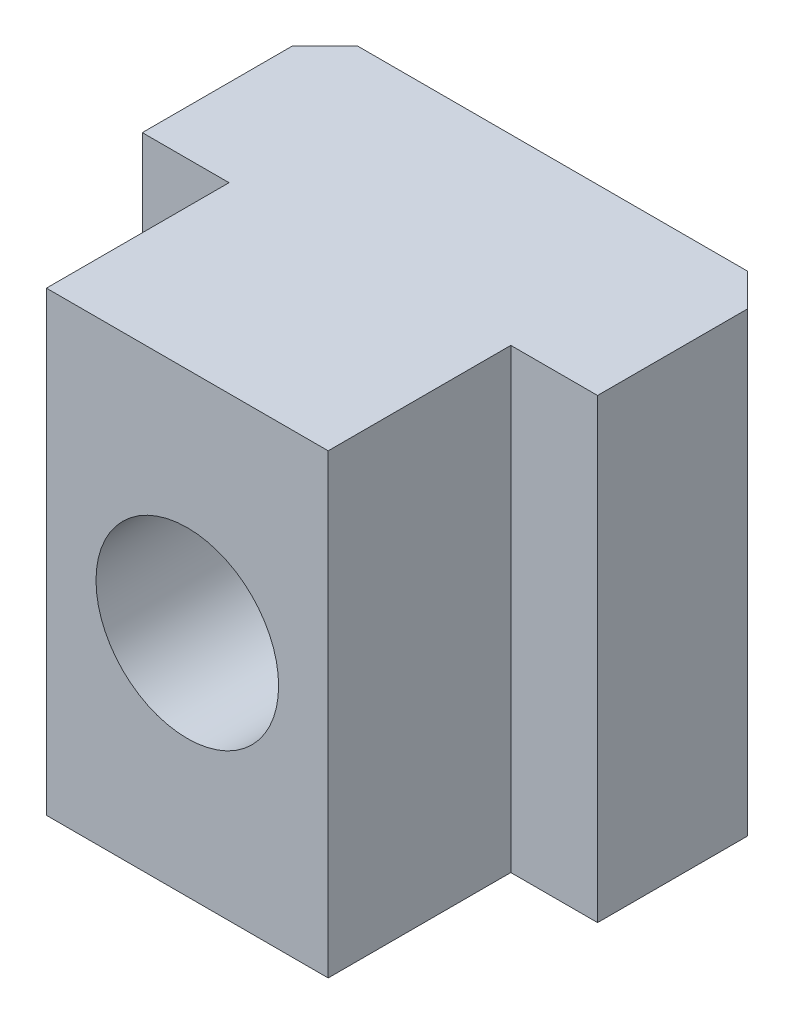
ISO-10303-21;
HEADER;
FILE_DESCRIPTION(('STEP AP214'),'2;1');
FILE_NAME('part.step','',(''),(''),'','','');
FILE_SCHEMA(('AUTOMOTIVE_DESIGN { 1 0 10303 214 1 1 1 1 }'));
ENDSEC;
DATA;
#1=APPLICATION_CONTEXT('core data for automotive mechanical design processes');
#2=APPLICATION_PROTOCOL_DEFINITION('international standard','automotive_design',2000,#1);
#3=PRODUCT_CONTEXT('',#1,'mechanical');
#4=PRODUCT('Part','Part','',(#3));
#5=PRODUCT_RELATED_PRODUCT_CATEGORY('part','',(#4));
#6=PRODUCT_DEFINITION_FORMATION('','',#4);
#7=PRODUCT_DEFINITION_CONTEXT('part definition',#1,'design');
#8=PRODUCT_DEFINITION('design','',#6,#7);
#9=PRODUCT_DEFINITION_SHAPE('','',#8);
#10=(LENGTH_UNIT() NAMED_UNIT(*) SI_UNIT(.MILLI.,.METRE.));
#11=(NAMED_UNIT(*) PLANE_ANGLE_UNIT() SI_UNIT($,.RADIAN.));
#12=(NAMED_UNIT(*) SI_UNIT($,.STERADIAN.) SOLID_ANGLE_UNIT());
#13=UNCERTAINTY_MEASURE_WITH_UNIT(LENGTH_MEASURE(1.E-05),#10,'distance_accuracy_value','');
#14=(GEOMETRIC_REPRESENTATION_CONTEXT(3) GLOBAL_UNCERTAINTY_ASSIGNED_CONTEXT((#13)) GLOBAL_UNIT_ASSIGNED_CONTEXT((#10,
#11,#12)) REPRESENTATION_CONTEXT('',''));
#15=CARTESIAN_POINT('',(0.,0.,0.));
#16=DIRECTION('',(0.,0.,1.));
#17=DIRECTION('',(1.,0.,0.));
#18=AXIS2_PLACEMENT_3D('',#15,#16,#17);
#19=CARTESIAN_POINT('',(-10.8,17.5,14.));
#20=DIRECTION('',(1.,0.,0.));
#21=DIRECTION('',(0.,0.,-1.));
#22=AXIS2_PLACEMENT_3D('',#19,#20,#21);
#23=PLANE('',#22);
#24=DIRECTION('',(0.,0.,1.));
#25=VECTOR('',#24,1.);
#26=CARTESIAN_POINT('',(-10.8,-17.5,14.));
#27=LINE('',#26,#25);
#28=CARTESIAN_POINT('',(-10.8,-17.5,0.));
#29=VERTEX_POINT('',#28);
#30=CARTESIAN_POINT('',(-10.8,-17.5,14.));
#31=VERTEX_POINT('',#30);
#32=EDGE_CURVE('E145',#29,#31,#27,.T.);
#33=ORIENTED_EDGE('',*,*,#32,.T.);
#34=DIRECTION('',(0.,-1.,0.));
#35=VECTOR('',#34,1.);
#36=CARTESIAN_POINT('',(-10.8,17.5,14.));
#37=LINE('',#36,#35);
#38=CARTESIAN_POINT('',(-10.8,17.5,14.));
#39=VERTEX_POINT('',#38);
#40=EDGE_CURVE('E11',#39,#31,#37,.T.);
#41=ORIENTED_EDGE('',*,*,#40,.F.);
#42=DIRECTION('',(0.,0.,1.));
#43=VECTOR('',#42,1.);
#44=CARTESIAN_POINT('',(-10.8,17.5,14.));
#45=LINE('',#44,#43);
#46=CARTESIAN_POINT('',(-10.8,17.5,0.));
#47=VERTEX_POINT('',#46);
#48=EDGE_CURVE('E164',#47,#39,#45,.T.);
#49=ORIENTED_EDGE('',*,*,#48,.F.);
#50=DIRECTION('',(0.,-1.,0.));
#51=VECTOR('',#50,1.);
#52=CARTESIAN_POINT('',(-10.8,17.5,0.));
#53=LINE('',#52,#51);
#54=EDGE_CURVE('E141',#47,#29,#53,.T.);
#55=ORIENTED_EDGE('',*,*,#54,.T.);
#56=EDGE_LOOP('',(#33,#41,#49,#55));
#57=FACE_BOUND('',#56,.T.);
#58=ADVANCED_FACE('F37',(#57),#23,.F.);
#59=CARTESIAN_POINT('',(10.8,17.5,14.));
#60=DIRECTION('',(0.,0.,-1.));
#61=DIRECTION('',(-1.,0.,0.));
#62=AXIS2_PLACEMENT_3D('',#59,#60,#61);
#63=PLANE('',#62);
#64=CARTESIAN_POINT('',(0.,0.,14.));
#65=DIRECTION('',(0.,0.,1.));
#66=DIRECTION('',(1.,0.,0.));
#67=AXIS2_PLACEMENT_3D('',#64,#65,#66);
#68=CIRCLE('',#67,7.);
#69=CARTESIAN_POINT('',(7.,0.,14.));
#70=VERTEX_POINT('',#69);
#71=EDGE_CURVE('E213',#70,#70,#68,.T.);
#72=ORIENTED_EDGE('',*,*,#71,.F.);
#73=EDGE_LOOP('',(#72));
#74=FACE_BOUND('',#73,.T.);
#75=DIRECTION('',(1.,0.,0.));
#76=VECTOR('',#75,1.);
#77=CARTESIAN_POINT('',(10.8,-17.5,14.));
#78=LINE('',#77,#76);
#79=CARTESIAN_POINT('',(10.8,-17.5,14.));
#80=VERTEX_POINT('',#79);
#81=EDGE_CURVE('E148',#31,#80,#78,.T.);
#82=ORIENTED_EDGE('',*,*,#81,.T.);
#83=DIRECTION('',(0.,-1.,0.));
#84=VECTOR('',#83,1.);
#85=CARTESIAN_POINT('',(10.8,17.5,14.));
#86=LINE('',#85,#84);
#87=CARTESIAN_POINT('',(10.8,17.5,14.));
#88=VERTEX_POINT('',#87);
#89=EDGE_CURVE('E45',#88,#80,#86,.T.);
#90=ORIENTED_EDGE('',*,*,#89,.F.);
#91=DIRECTION('',(1.,0.,0.));
#92=VECTOR('',#91,1.);
#93=CARTESIAN_POINT('',(10.8,17.5,14.));
#94=LINE('',#93,#92);
#95=EDGE_CURVE('E102',#39,#88,#94,.T.);
#96=ORIENTED_EDGE('',*,*,#95,.F.);
#97=ORIENTED_EDGE('',*,*,#40,.T.);
#98=EDGE_LOOP('',(#82,#90,#96,#97));
#99=FACE_BOUND('',#98,.T.);
#100=ADVANCED_FACE('F219',(#74,#99),#63,.F.);
#101=CARTESIAN_POINT('',(10.8,17.5,0.));
#102=DIRECTION('',(-1.,0.,0.));
#103=DIRECTION('',(0.,0.,1.));
#104=AXIS2_PLACEMENT_3D('',#101,#102,#103);
#105=PLANE('',#104);
#106=DIRECTION('',(0.,0.,-1.));
#107=VECTOR('',#106,1.);
#108=CARTESIAN_POINT('',(10.8,-17.5,0.));
#109=LINE('',#108,#107);
#110=CARTESIAN_POINT('',(10.8,-17.5,0.));
#111=VERTEX_POINT('',#110);
#112=EDGE_CURVE('E151',#80,#111,#109,.T.);
#113=ORIENTED_EDGE('',*,*,#112,.T.);
#114=DIRECTION('',(0.,-1.,0.));
#115=VECTOR('',#114,1.);
#116=CARTESIAN_POINT('',(10.8,17.5,0.));
#117=LINE('',#116,#115);
#118=CARTESIAN_POINT('',(10.8,17.5,0.));
#119=VERTEX_POINT('',#118);
#120=EDGE_CURVE('E177',#119,#111,#117,.T.);
#121=ORIENTED_EDGE('',*,*,#120,.F.);
#122=DIRECTION('',(0.,0.,-1.));
#123=VECTOR('',#122,1.);
#124=CARTESIAN_POINT('',(10.8,17.5,0.));
#125=LINE('',#124,#123);
#126=EDGE_CURVE('E185',#88,#119,#125,.T.);
#127=ORIENTED_EDGE('',*,*,#126,.F.);
#128=ORIENTED_EDGE('',*,*,#89,.T.);
#129=EDGE_LOOP('',(#113,#121,#127,#128));
#130=FACE_BOUND('',#129,.T.);
#131=ADVANCED_FACE('F183',(#130),#105,.F.);
#132=CARTESIAN_POINT('',(17.45,17.5,0.));
#133=DIRECTION('',(0.,0.,-1.));
#134=DIRECTION('',(-1.,0.,0.));
#135=AXIS2_PLACEMENT_3D('',#132,#133,#134);
#136=PLANE('',#135);
#137=DIRECTION('',(1.,0.,0.));
#138=VECTOR('',#137,1.);
#139=CARTESIAN_POINT('',(17.45,-17.5,0.));
#140=LINE('',#139,#138);
#141=CARTESIAN_POINT('',(17.45,-17.5,0.));
#142=VERTEX_POINT('',#141);
#143=EDGE_CURVE('E153',#111,#142,#140,.T.);
#144=ORIENTED_EDGE('',*,*,#143,.T.);
#145=DIRECTION('',(0.,-1.,0.));
#146=VECTOR('',#145,1.);
#147=CARTESIAN_POINT('',(17.45,17.5,0.));
#148=LINE('',#147,#146);
#149=CARTESIAN_POINT('',(17.45,17.5,0.));
#150=VERTEX_POINT('',#149);
#151=EDGE_CURVE('E174',#150,#142,#148,.T.);
#152=ORIENTED_EDGE('',*,*,#151,.F.);
#153=DIRECTION('',(1.,0.,0.));
#154=VECTOR('',#153,1.);
#155=CARTESIAN_POINT('',(17.45,17.5,0.));
#156=LINE('',#155,#154);
#157=EDGE_CURVE('E203',#119,#150,#156,.T.);
#158=ORIENTED_EDGE('',*,*,#157,.F.);
#159=ORIENTED_EDGE('',*,*,#120,.T.);
#160=EDGE_LOOP('',(#144,#152,#158,#159));
#161=FACE_BOUND('',#160,.T.);
#162=ADVANCED_FACE('F194',(#161),#136,.F.);
#163=CARTESIAN_POINT('',(17.45,17.5,-11.5));
#164=DIRECTION('',(-1.,0.,0.));
#165=DIRECTION('',(0.,0.,1.));
#166=AXIS2_PLACEMENT_3D('',#163,#164,#165);
#167=PLANE('',#166);
#168=DIRECTION('',(0.,0.,-1.));
#169=VECTOR('',#168,1.);
#170=CARTESIAN_POINT('',(17.45,-17.5,-11.5));
#171=LINE('',#170,#169);
#172=CARTESIAN_POINT('',(17.45,-17.5,-11.5));
#173=VERTEX_POINT('',#172);
#174=EDGE_CURVE('E155',#142,#173,#171,.T.);
#175=ORIENTED_EDGE('',*,*,#174,.T.);
#176=DIRECTION('',(0.,-1.,0.));
#177=VECTOR('',#176,1.);
#178=CARTESIAN_POINT('',(17.45,17.5,-11.5));
#179=LINE('',#178,#177);
#180=CARTESIAN_POINT('',(17.45,17.5,-11.5));
#181=VERTEX_POINT('',#180);
#182=EDGE_CURVE('E171',#181,#173,#179,.T.);
#183=ORIENTED_EDGE('',*,*,#182,.F.);
#184=DIRECTION('',(0.,0.,-1.));
#185=VECTOR('',#184,1.);
#186=CARTESIAN_POINT('',(17.45,17.5,-11.5));
#187=LINE('',#186,#185);
#188=EDGE_CURVE('E200',#150,#181,#187,.T.);
#189=ORIENTED_EDGE('',*,*,#188,.F.);
#190=ORIENTED_EDGE('',*,*,#151,.T.);
#191=EDGE_LOOP('',(#175,#183,#189,#190));
#192=FACE_BOUND('',#191,.T.);
#193=ADVANCED_FACE('F198',(#192),#167,.F.);
#194=CARTESIAN_POINT('',(14.95,17.5,-14.));
#195=DIRECTION('',(-0.707106781186548,0.,0.707106781186548));
#196=DIRECTION('',(0.707106781186548,0.,0.707106781186548));
#197=AXIS2_PLACEMENT_3D('',#194,#195,#196);
#198=PLANE('',#197);
#199=DIRECTION('',(-0.707106781186548,0.,-0.707106781186548));
#200=VECTOR('',#199,1.);
#201=CARTESIAN_POINT('',(14.95,-17.5,-14.));
#202=LINE('',#201,#200);
#203=CARTESIAN_POINT('',(14.95,-17.5,-14.));
#204=VERTEX_POINT('',#203);
#205=EDGE_CURVE('E157',#173,#204,#202,.T.);
#206=ORIENTED_EDGE('',*,*,#205,.T.);
#207=DIRECTION('',(0.,-1.,0.));
#208=VECTOR('',#207,1.);
#209=CARTESIAN_POINT('',(14.95,17.5,-14.));
#210=LINE('',#209,#208);
#211=CARTESIAN_POINT('',(14.95,17.5,-14.));
#212=VERTEX_POINT('',#211);
#213=EDGE_CURVE('E168',#212,#204,#210,.T.);
#214=ORIENTED_EDGE('',*,*,#213,.F.);
#215=DIRECTION('',(-0.707106781186548,0.,-0.707106781186548));
#216=VECTOR('',#215,1.);
#217=CARTESIAN_POINT('',(14.95,17.5,-14.));
#218=LINE('',#217,#216);
#219=EDGE_CURVE('E202',#181,#212,#218,.T.);
#220=ORIENTED_EDGE('',*,*,#219,.F.);
#221=ORIENTED_EDGE('',*,*,#182,.T.);
#222=EDGE_LOOP('',(#206,#214,#220,#221));
#223=FACE_BOUND('',#222,.T.);
#224=ADVANCED_FACE('F229',(#223),#198,.F.);
#225=CARTESIAN_POINT('',(-14.95,17.5,-14.));
#226=DIRECTION('',(0.,0.,1.));
#227=DIRECTION('',(1.,0.,0.));
#228=AXIS2_PLACEMENT_3D('',#225,#226,#227);
#229=PLANE('',#228);
#230=CARTESIAN_POINT('',(0.,0.,-14.));
#231=DIRECTION('',(0.,0.,1.));
#232=DIRECTION('',(1.,0.,0.));
#233=AXIS2_PLACEMENT_3D('',#230,#231,#232);
#234=CIRCLE('',#233,6.99999999999999);
#235=CARTESIAN_POINT('',(6.99999999999999,0.,-14.));
#236=VERTEX_POINT('',#235);
#237=EDGE_CURVE('E149',#236,#236,#234,.T.);
#238=ORIENTED_EDGE('',*,*,#237,.T.);
#239=EDGE_LOOP('',(#238));
#240=FACE_BOUND('',#239,.T.);
#241=DIRECTION('',(-1.,0.,0.));
#242=VECTOR('',#241,1.);
#243=CARTESIAN_POINT('',(-14.95,-17.5,-14.));
#244=LINE('',#243,#242);
#245=CARTESIAN_POINT('',(-14.95,-17.5,-14.));
#246=VERTEX_POINT('',#245);
#247=EDGE_CURVE('E159',#204,#246,#244,.T.);
#248=ORIENTED_EDGE('',*,*,#247,.T.);
#249=DIRECTION('',(0.,-1.,0.));
#250=VECTOR('',#249,1.);
#251=CARTESIAN_POINT('',(-14.95,17.5,-14.));
#252=LINE('',#251,#250);
#253=CARTESIAN_POINT('',(-14.95,17.5,-14.));
#254=VERTEX_POINT('',#253);
#255=EDGE_CURVE('E136',#254,#246,#252,.T.);
#256=ORIENTED_EDGE('',*,*,#255,.F.);
#257=DIRECTION('',(-1.,0.,0.));
#258=VECTOR('',#257,1.);
#259=CARTESIAN_POINT('',(-14.95,17.5,-14.));
#260=LINE('',#259,#258);
#261=EDGE_CURVE('E127',#212,#254,#260,.T.);
#262=ORIENTED_EDGE('',*,*,#261,.F.);
#263=ORIENTED_EDGE('',*,*,#213,.T.);
#264=EDGE_LOOP('',(#248,#256,#262,#263));
#265=FACE_BOUND('',#264,.T.);
#266=ADVANCED_FACE('F226',(#240,#265),#229,.F.);
#267=CARTESIAN_POINT('',(-17.45,17.5,-11.5));
#268=DIRECTION('',(0.707106781186548,0.,0.707106781186548));
#269=DIRECTION('',(0.707106781186548,0.,-0.707106781186548));
#270=AXIS2_PLACEMENT_3D('',#267,#268,#269);
#271=PLANE('',#270);
#272=DIRECTION('',(-0.707106781186548,0.,0.707106781186548));
#273=VECTOR('',#272,1.);
#274=CARTESIAN_POINT('',(-17.45,-17.5,-11.5));
#275=LINE('',#274,#273);
#276=CARTESIAN_POINT('',(-17.45,-17.5,-11.5));
#277=VERTEX_POINT('',#276);
#278=EDGE_CURVE('E135',#246,#277,#275,.T.);
#279=ORIENTED_EDGE('',*,*,#278,.T.);
#280=DIRECTION('',(0.,-1.,0.));
#281=VECTOR('',#280,1.);
#282=CARTESIAN_POINT('',(-17.45,17.5,-11.5));
#283=LINE('',#282,#281);
#284=CARTESIAN_POINT('',(-17.45,17.5,-11.5));
#285=VERTEX_POINT('',#284);
#286=EDGE_CURVE('E132',#285,#277,#283,.T.);
#287=ORIENTED_EDGE('',*,*,#286,.F.);
#288=DIRECTION('',(-0.707106781186548,0.,0.707106781186548));
#289=VECTOR('',#288,1.);
#290=CARTESIAN_POINT('',(-17.45,17.5,-11.5));
#291=LINE('',#290,#289);
#292=EDGE_CURVE('E121',#254,#285,#291,.T.);
#293=ORIENTED_EDGE('',*,*,#292,.F.);
#294=ORIENTED_EDGE('',*,*,#255,.T.);
#295=EDGE_LOOP('',(#279,#287,#293,#294));
#296=FACE_BOUND('',#295,.T.);
#297=ADVANCED_FACE('F133',(#296),#271,.F.);
#298=CARTESIAN_POINT('',(-17.45,17.5,0.));
#299=DIRECTION('',(1.,0.,0.));
#300=DIRECTION('',(0.,0.,-1.));
#301=AXIS2_PLACEMENT_3D('',#298,#299,#300);
#302=PLANE('',#301);
#303=DIRECTION('',(0.,0.,1.));
#304=VECTOR('',#303,1.);
#305=CARTESIAN_POINT('',(-17.45,-17.5,0.));
#306=LINE('',#305,#304);
#307=CARTESIAN_POINT('',(-17.45,-17.5,0.));
#308=VERTEX_POINT('',#307);
#309=EDGE_CURVE('E88',#277,#308,#306,.T.);
#310=ORIENTED_EDGE('',*,*,#309,.T.);
#311=DIRECTION('',(0.,-1.,0.));
#312=VECTOR('',#311,1.);
#313=CARTESIAN_POINT('',(-17.45,17.5,0.));
#314=LINE('',#313,#312);
#315=CARTESIAN_POINT('',(-17.45,17.5,0.));
#316=VERTEX_POINT('',#315);
#317=EDGE_CURVE('E137',#316,#308,#314,.T.);
#318=ORIENTED_EDGE('',*,*,#317,.F.);
#319=DIRECTION('',(0.,0.,1.));
#320=VECTOR('',#319,1.);
#321=CARTESIAN_POINT('',(-17.45,17.5,0.));
#322=LINE('',#321,#320);
#323=EDGE_CURVE('E125',#285,#316,#322,.T.);
#324=ORIENTED_EDGE('',*,*,#323,.F.);
#325=ORIENTED_EDGE('',*,*,#286,.T.);
#326=EDGE_LOOP('',(#310,#318,#324,#325));
#327=FACE_BOUND('',#326,.T.);
#328=ADVANCED_FACE('F139',(#327),#302,.F.);
#329=CARTESIAN_POINT('',(-10.8,17.5,0.));
#330=DIRECTION('',(0.,0.,-1.));
#331=DIRECTION('',(-1.,0.,0.));
#332=AXIS2_PLACEMENT_3D('',#329,#330,#331);
#333=PLANE('',#332);
#334=DIRECTION('',(1.,0.,0.));
#335=VECTOR('',#334,1.);
#336=CARTESIAN_POINT('',(-10.8,-17.5,0.));
#337=LINE('',#336,#335);
#338=EDGE_CURVE('E94',#308,#29,#337,.T.);
#339=ORIENTED_EDGE('',*,*,#338,.T.);
#340=ORIENTED_EDGE('',*,*,#54,.F.);
#341=DIRECTION('',(1.,0.,0.));
#342=VECTOR('',#341,1.);
#343=CARTESIAN_POINT('',(-10.8,17.5,0.));
#344=LINE('',#343,#342);
#345=EDGE_CURVE('E53',#316,#47,#344,.T.);
#346=ORIENTED_EDGE('',*,*,#345,.F.);
#347=ORIENTED_EDGE('',*,*,#317,.T.);
#348=EDGE_LOOP('',(#339,#340,#346,#347));
#349=FACE_BOUND('',#348,.T.);
#350=ADVANCED_FACE('F286',(#349),#333,.F.);
#351=CARTESIAN_POINT('',(0.,17.5,0.));
#352=DIRECTION('',(0.,1.,0.));
#353=DIRECTION('',(0.,0.,1.));
#354=AXIS2_PLACEMENT_3D('',#351,#352,#353);
#355=PLANE('',#354);
#356=ORIENTED_EDGE('',*,*,#48,.T.);
#357=ORIENTED_EDGE('',*,*,#95,.T.);
#358=ORIENTED_EDGE('',*,*,#126,.T.);
#359=ORIENTED_EDGE('',*,*,#157,.T.);
#360=ORIENTED_EDGE('',*,*,#188,.T.);
#361=ORIENTED_EDGE('',*,*,#219,.T.);
#362=ORIENTED_EDGE('',*,*,#261,.T.);
#363=ORIENTED_EDGE('',*,*,#292,.T.);
#364=ORIENTED_EDGE('',*,*,#323,.T.);
#365=ORIENTED_EDGE('',*,*,#345,.T.);
#366=EDGE_LOOP('',(#356,#357,#358,#359,#360,#361,#362,#363,#364,#365));
#367=FACE_BOUND('',#366,.T.);
#368=ADVANCED_FACE('F123',(#367),#355,.T.);
#369=CARTESIAN_POINT('',(0.,-17.5,0.));
#370=DIRECTION('',(0.,1.,0.));
#371=DIRECTION('',(0.,0.,1.));
#372=AXIS2_PLACEMENT_3D('',#369,#370,#371);
#373=PLANE('',#372);
#374=ORIENTED_EDGE('',*,*,#32,.F.);
#375=ORIENTED_EDGE('',*,*,#338,.F.);
#376=ORIENTED_EDGE('',*,*,#309,.F.);
#377=ORIENTED_EDGE('',*,*,#278,.F.);
#378=ORIENTED_EDGE('',*,*,#247,.F.);
#379=ORIENTED_EDGE('',*,*,#205,.F.);
#380=ORIENTED_EDGE('',*,*,#174,.F.);
#381=ORIENTED_EDGE('',*,*,#143,.F.);
#382=ORIENTED_EDGE('',*,*,#112,.F.);
#383=ORIENTED_EDGE('',*,*,#81,.F.);
#384=EDGE_LOOP('',(#374,#375,#376,#377,#378,#379,#380,#381,#382,#383));
#385=FACE_BOUND('',#384,.T.);
#386=ADVANCED_FACE('F189',(#385),#373,.F.);
#387=CARTESIAN_POINT('',(0.,0.,14.));
#388=DIRECTION('',(0.,0.,1.));
#389=DIRECTION('',(1.,0.,0.));
#390=AXIS2_PLACEMENT_3D('',#387,#388,#389);
#391=CYLINDRICAL_SURFACE('',#390,6.99999999999999);
#392=ORIENTED_EDGE('',*,*,#237,.F.);
#393=EDGE_LOOP('',(#392));
#394=FACE_BOUND('',#393,.T.);
#395=ORIENTED_EDGE('',*,*,#71,.T.);
#396=EDGE_LOOP('',(#395));
#397=FACE_BOUND('',#396,.T.);
#398=ADVANCED_FACE('F217',(#394,#397),#391,.F.);
#399=CLOSED_SHELL('',(#58,#100,#131,#162,#193,#224,#266,#297,#328,#350,#368,#386,#398));
#400=MANIFOLD_SOLID_BREP('B2',#399);
#401=ADVANCED_BREP_SHAPE_REPRESENTATION('',(#18,#400),#14);
#402=SHAPE_DEFINITION_REPRESENTATION(#9,#401);
ENDSEC;
END-ISO-10303-21;
